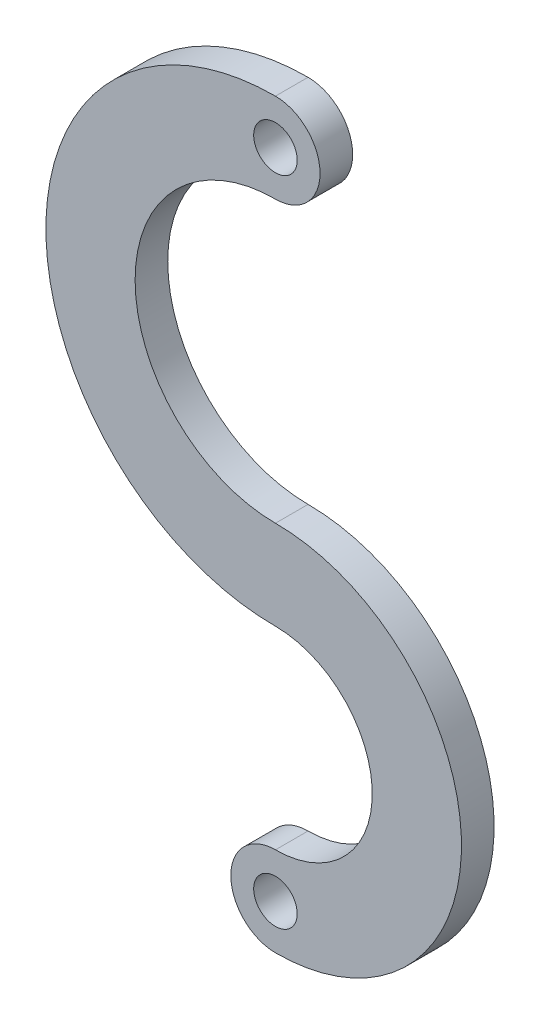
ISO-10303-21;
HEADER;
FILE_DESCRIPTION(('STEP AP214'),'2;1');
FILE_NAME('part.step','',(''),(''),'','','');
FILE_SCHEMA(('AUTOMOTIVE_DESIGN { 1 0 10303 214 1 1 1 1 }'));
ENDSEC;
DATA;
#1=APPLICATION_CONTEXT('core data for automotive mechanical design processes');
#2=APPLICATION_PROTOCOL_DEFINITION('international standard','automotive_design',2000,#1);
#3=PRODUCT_CONTEXT('',#1,'mechanical');
#4=PRODUCT('Part','Part','',(#3));
#5=PRODUCT_RELATED_PRODUCT_CATEGORY('part','',(#4));
#6=PRODUCT_DEFINITION_FORMATION('','',#4);
#7=PRODUCT_DEFINITION_CONTEXT('part definition',#1,'design');
#8=PRODUCT_DEFINITION('design','',#6,#7);
#9=PRODUCT_DEFINITION_SHAPE('','',#8);
#10=(LENGTH_UNIT() NAMED_UNIT(*) SI_UNIT(.MILLI.,.METRE.));
#11=(NAMED_UNIT(*) PLANE_ANGLE_UNIT() SI_UNIT($,.RADIAN.));
#12=(NAMED_UNIT(*) SI_UNIT($,.STERADIAN.) SOLID_ANGLE_UNIT());
#13=UNCERTAINTY_MEASURE_WITH_UNIT(LENGTH_MEASURE(1.E-05),#10,'distance_accuracy_value','');
#14=(GEOMETRIC_REPRESENTATION_CONTEXT(3) GLOBAL_UNCERTAINTY_ASSIGNED_CONTEXT((#13)) GLOBAL_UNIT_ASSIGNED_CONTEXT((#10,
#11,#12)) REPRESENTATION_CONTEXT('',''));
#15=CARTESIAN_POINT('',(0.,0.,0.));
#16=DIRECTION('',(0.,0.,1.));
#17=DIRECTION('',(1.,0.,0.));
#18=AXIS2_PLACEMENT_3D('',#15,#16,#17);
#19=CARTESIAN_POINT('',(0.,-2.84134729219745,1.5));
#20=DIRECTION('',(0.,0.,1.));
#21=DIRECTION('',(1.,0.,0.));
#22=AXIS2_PLACEMENT_3D('',#19,#20,#21);
#23=PLANE('',#22);
#24=CARTESIAN_POINT('',(0.,1.40865270780255,1.5));
#25=DIRECTION('',(0.,0.,1.));
#26=DIRECTION('',(1.,0.,0.));
#27=AXIS2_PLACEMENT_3D('',#24,#25,#26);
#28=CIRCLE('',#27,1.);
#29=CARTESIAN_POINT('',(1.,1.40865270780255,1.5));
#30=VERTEX_POINT('',#29);
#31=EDGE_CURVE('E121',#30,#30,#28,.T.);
#32=ORIENTED_EDGE('',*,*,#31,.F.);
#33=EDGE_LOOP('',(#32));
#34=FACE_BOUND('',#33,.T.);
#35=CARTESIAN_POINT('',(0.,1.40865270780255,1.5));
#36=DIRECTION('',(0.,0.,1.));
#37=DIRECTION('',(1.,0.,0.));
#38=AXIS2_PLACEMENT_3D('',#35,#36,#37);
#39=CIRCLE('',#38,2.05);
#40=CARTESIAN_POINT('',(0.,-0.641347292197447,1.5));
#41=VERTEX_POINT('',#40);
#42=CARTESIAN_POINT('',(0.,3.45865270780255,1.5));
#43=VERTEX_POINT('',#42);
#44=EDGE_CURVE('E128',#41,#43,#39,.T.);
#45=ORIENTED_EDGE('',*,*,#44,.T.);
#46=CARTESIAN_POINT('',(0.,-7.09134729219745,1.5));
#47=DIRECTION('',(0.,0.,1.));
#48=DIRECTION('',(1.,0.,0.));
#49=AXIS2_PLACEMENT_3D('',#46,#47,#48);
#50=CIRCLE('',#49,10.55);
#51=CARTESIAN_POINT('',(0.,-17.6413472921974,1.5));
#52=VERTEX_POINT('',#51);
#53=EDGE_CURVE('E86',#43,#52,#50,.T.);
#54=ORIENTED_EDGE('',*,*,#53,.T.);
#55=CARTESIAN_POINT('',(0.,-22.0913472921974,1.5));
#56=DIRECTION('',(0.,0.,-1.));
#57=DIRECTION('',(1.,0.,0.));
#58=AXIS2_PLACEMENT_3D('',#55,#56,#57);
#59=CIRCLE('',#58,4.45);
#60=CARTESIAN_POINT('',(0.,-26.5413472921974,1.5));
#61=VERTEX_POINT('',#60);
#62=EDGE_CURVE('E99',#52,#61,#59,.T.);
#63=ORIENTED_EDGE('',*,*,#62,.T.);
#64=CARTESIAN_POINT('',(0.,-28.5913472921974,1.5));
#65=DIRECTION('',(0.,0.,1.));
#66=DIRECTION('',(1.,0.,0.));
#67=AXIS2_PLACEMENT_3D('',#64,#65,#66);
#68=CIRCLE('',#67,2.05);
#69=CARTESIAN_POINT('',(0.,-30.6413472921974,1.5));
#70=VERTEX_POINT('',#69);
#71=EDGE_CURVE('E93',#61,#70,#68,.T.);
#72=ORIENTED_EDGE('',*,*,#71,.T.);
#73=CARTESIAN_POINT('',(0.,-22.0913472921974,1.5));
#74=DIRECTION('',(0.,0.,1.));
#75=DIRECTION('',(1.,0.,0.));
#76=AXIS2_PLACEMENT_3D('',#73,#74,#75);
#77=CIRCLE('',#76,8.55);
#78=CARTESIAN_POINT('',(0.,-13.5413472921974,1.5));
#79=VERTEX_POINT('',#78);
#80=EDGE_CURVE('E97',#70,#79,#77,.T.);
#81=ORIENTED_EDGE('',*,*,#80,.T.);
#82=CARTESIAN_POINT('',(0.,-7.09134729219745,1.5));
#83=DIRECTION('',(0.,0.,-1.));
#84=DIRECTION('',(1.,0.,0.));
#85=AXIS2_PLACEMENT_3D('',#82,#83,#84);
#86=CIRCLE('',#85,6.45);
#87=EDGE_CURVE('E49',#79,#41,#86,.T.);
#88=ORIENTED_EDGE('',*,*,#87,.T.);
#89=EDGE_LOOP('',(#45,#54,#63,#72,#81,#88));
#90=FACE_BOUND('',#89,.T.);
#91=CARTESIAN_POINT('',(0.,-28.5913472921974,1.5));
#92=DIRECTION('',(0.,0.,1.));
#93=DIRECTION('',(1.,0.,0.));
#94=AXIS2_PLACEMENT_3D('',#91,#92,#93);
#95=CIRCLE('',#94,1.);
#96=CARTESIAN_POINT('',(1.,-28.5913472921974,1.5));
#97=VERTEX_POINT('',#96);
#98=EDGE_CURVE('E170',#97,#97,#95,.T.);
#99=ORIENTED_EDGE('',*,*,#98,.F.);
#100=EDGE_LOOP('',(#99));
#101=FACE_BOUND('',#100,.T.);
#102=ADVANCED_FACE('F32',(#34,#90,#101),#23,.T.);
#103=CARTESIAN_POINT('',(0.,-2.84134729219745,0.));
#104=DIRECTION('',(0.,0.,1.));
#105=DIRECTION('',(1.,0.,0.));
#106=AXIS2_PLACEMENT_3D('',#103,#104,#105);
#107=PLANE('',#106);
#108=CARTESIAN_POINT('',(0.,1.40865270780255,0.));
#109=DIRECTION('',(0.,0.,1.));
#110=DIRECTION('',(1.,0.,0.));
#111=AXIS2_PLACEMENT_3D('',#108,#109,#110);
#112=CIRCLE('',#111,2.05);
#113=CARTESIAN_POINT('',(0.,-0.641347292197447,0.));
#114=VERTEX_POINT('',#113);
#115=CARTESIAN_POINT('',(0.,3.45865270780255,0.));
#116=VERTEX_POINT('',#115);
#117=EDGE_CURVE('E117',#114,#116,#112,.T.);
#118=ORIENTED_EDGE('',*,*,#117,.F.);
#119=CARTESIAN_POINT('',(0.,-7.09134729219745,0.));
#120=DIRECTION('',(0.,0.,-1.));
#121=DIRECTION('',(1.,0.,0.));
#122=AXIS2_PLACEMENT_3D('',#119,#120,#121);
#123=CIRCLE('',#122,6.45);
#124=CARTESIAN_POINT('',(0.,-13.5413472921974,0.));
#125=VERTEX_POINT('',#124);
#126=EDGE_CURVE('E78',#125,#114,#123,.T.);
#127=ORIENTED_EDGE('',*,*,#126,.F.);
#128=CARTESIAN_POINT('',(0.,-22.0913472921974,0.));
#129=DIRECTION('',(0.,0.,1.));
#130=DIRECTION('',(1.,0.,0.));
#131=AXIS2_PLACEMENT_3D('',#128,#129,#130);
#132=CIRCLE('',#131,8.55);
#133=CARTESIAN_POINT('',(0.,-30.6413472921974,0.));
#134=VERTEX_POINT('',#133);
#135=EDGE_CURVE('E72',#134,#125,#132,.T.);
#136=ORIENTED_EDGE('',*,*,#135,.F.);
#137=CARTESIAN_POINT('',(0.,-28.5913472921974,0.));
#138=DIRECTION('',(0.,0.,1.));
#139=DIRECTION('',(1.,0.,0.));
#140=AXIS2_PLACEMENT_3D('',#137,#138,#139);
#141=CIRCLE('',#140,2.05);
#142=CARTESIAN_POINT('',(0.,-26.5413472921974,0.));
#143=VERTEX_POINT('',#142);
#144=EDGE_CURVE('E107',#143,#134,#141,.T.);
#145=ORIENTED_EDGE('',*,*,#144,.F.);
#146=CARTESIAN_POINT('',(0.,-22.0913472921974,0.));
#147=DIRECTION('',(0.,0.,-1.));
#148=DIRECTION('',(1.,0.,0.));
#149=AXIS2_PLACEMENT_3D('',#146,#147,#148);
#150=CIRCLE('',#149,4.45);
#151=CARTESIAN_POINT('',(0.,-17.6413472921974,0.));
#152=VERTEX_POINT('',#151);
#153=EDGE_CURVE('E123',#152,#143,#150,.T.);
#154=ORIENTED_EDGE('',*,*,#153,.F.);
#155=CARTESIAN_POINT('',(0.,-7.09134729219745,0.));
#156=DIRECTION('',(0.,0.,1.));
#157=DIRECTION('',(1.,0.,0.));
#158=AXIS2_PLACEMENT_3D('',#155,#156,#157);
#159=CIRCLE('',#158,10.55);
#160=EDGE_CURVE('E120',#116,#152,#159,.T.);
#161=ORIENTED_EDGE('',*,*,#160,.F.);
#162=EDGE_LOOP('',(#118,#127,#136,#145,#154,#161));
#163=FACE_BOUND('',#162,.T.);
#164=CARTESIAN_POINT('',(0.,1.40865270780255,0.));
#165=DIRECTION('',(0.,0.,1.));
#166=DIRECTION('',(1.,0.,0.));
#167=AXIS2_PLACEMENT_3D('',#164,#165,#166);
#168=CIRCLE('',#167,1.);
#169=CARTESIAN_POINT('',(1.,1.40865270780255,0.));
#170=VERTEX_POINT('',#169);
#171=EDGE_CURVE('E176',#170,#170,#168,.T.);
#172=ORIENTED_EDGE('',*,*,#171,.T.);
#173=EDGE_LOOP('',(#172));
#174=FACE_BOUND('',#173,.T.);
#175=CARTESIAN_POINT('',(0.,-28.5913472921974,0.));
#176=DIRECTION('',(0.,0.,1.));
#177=DIRECTION('',(1.,0.,0.));
#178=AXIS2_PLACEMENT_3D('',#175,#176,#177);
#179=CIRCLE('',#178,1.);
#180=CARTESIAN_POINT('',(1.,-28.5913472921974,0.));
#181=VERTEX_POINT('',#180);
#182=EDGE_CURVE('E173',#181,#181,#179,.T.);
#183=ORIENTED_EDGE('',*,*,#182,.T.);
#184=EDGE_LOOP('',(#183));
#185=FACE_BOUND('',#184,.T.);
#186=ADVANCED_FACE('F137',(#163,#174,#185),#107,.F.);
#187=CARTESIAN_POINT('',(0.,1.40865270780255,1.5));
#188=DIRECTION('',(0.,0.,-1.));
#189=DIRECTION('',(-1.,0.,0.));
#190=AXIS2_PLACEMENT_3D('',#187,#188,#189);
#191=CYLINDRICAL_SURFACE('',#190,2.05);
#192=ORIENTED_EDGE('',*,*,#117,.T.);
#193=DIRECTION('',(0.,0.,-1.));
#194=VECTOR('',#193,1.);
#195=CARTESIAN_POINT('',(0.,3.45865270780255,1.5));
#196=LINE('',#195,#194);
#197=EDGE_CURVE('E11',#43,#116,#196,.T.);
#198=ORIENTED_EDGE('',*,*,#197,.F.);
#199=ORIENTED_EDGE('',*,*,#44,.F.);
#200=DIRECTION('',(0.,0.,-1.));
#201=VECTOR('',#200,1.);
#202=CARTESIAN_POINT('',(0.,-0.641347292197447,1.5));
#203=LINE('',#202,#201);
#204=EDGE_CURVE('E113',#41,#114,#203,.T.);
#205=ORIENTED_EDGE('',*,*,#204,.T.);
#206=EDGE_LOOP('',(#192,#198,#199,#205));
#207=FACE_BOUND('',#206,.T.);
#208=ADVANCED_FACE('F34',(#207),#191,.T.);
#209=CARTESIAN_POINT('',(0.,-7.09134729219745,1.5));
#210=DIRECTION('',(0.,0.,-1.));
#211=DIRECTION('',(-1.,0.,0.));
#212=AXIS2_PLACEMENT_3D('',#209,#210,#211);
#213=CYLINDRICAL_SURFACE('',#212,10.55);
#214=ORIENTED_EDGE('',*,*,#160,.T.);
#215=DIRECTION('',(0.,0.,-1.));
#216=VECTOR('',#215,1.);
#217=CARTESIAN_POINT('',(0.,-17.6413472921974,1.5));
#218=LINE('',#217,#216);
#219=EDGE_CURVE('E41',#52,#152,#218,.T.);
#220=ORIENTED_EDGE('',*,*,#219,.F.);
#221=ORIENTED_EDGE('',*,*,#53,.F.);
#222=ORIENTED_EDGE('',*,*,#197,.T.);
#223=EDGE_LOOP('',(#214,#220,#221,#222));
#224=FACE_BOUND('',#223,.T.);
#225=ADVANCED_FACE('F217',(#224),#213,.T.);
#226=CARTESIAN_POINT('',(0.,-22.0913472921974,1.5));
#227=DIRECTION('',(0.,0.,-1.));
#228=DIRECTION('',(-1.,0.,0.));
#229=AXIS2_PLACEMENT_3D('',#226,#227,#228);
#230=CYLINDRICAL_SURFACE('',#229,4.45);
#231=ORIENTED_EDGE('',*,*,#153,.T.);
#232=DIRECTION('',(0.,0.,-1.));
#233=VECTOR('',#232,1.);
#234=CARTESIAN_POINT('',(0.,-26.5413472921974,1.5));
#235=LINE('',#234,#233);
#236=EDGE_CURVE('E108',#61,#143,#235,.T.);
#237=ORIENTED_EDGE('',*,*,#236,.F.);
#238=ORIENTED_EDGE('',*,*,#62,.F.);
#239=ORIENTED_EDGE('',*,*,#219,.T.);
#240=EDGE_LOOP('',(#231,#237,#238,#239));
#241=FACE_BOUND('',#240,.T.);
#242=ADVANCED_FACE('F134',(#241),#230,.F.);
#243=CARTESIAN_POINT('',(0.,-28.5913472921974,1.5));
#244=DIRECTION('',(0.,0.,-1.));
#245=DIRECTION('',(-1.,0.,0.));
#246=AXIS2_PLACEMENT_3D('',#243,#244,#245);
#247=CYLINDRICAL_SURFACE('',#246,2.05);
#248=ORIENTED_EDGE('',*,*,#144,.T.);
#249=DIRECTION('',(0.,0.,-1.));
#250=VECTOR('',#249,1.);
#251=CARTESIAN_POINT('',(0.,-30.6413472921974,1.5));
#252=LINE('',#251,#250);
#253=EDGE_CURVE('E104',#70,#134,#252,.T.);
#254=ORIENTED_EDGE('',*,*,#253,.F.);
#255=ORIENTED_EDGE('',*,*,#71,.F.);
#256=ORIENTED_EDGE('',*,*,#236,.T.);
#257=EDGE_LOOP('',(#248,#254,#255,#256));
#258=FACE_BOUND('',#257,.T.);
#259=ADVANCED_FACE('F105',(#258),#247,.T.);
#260=CARTESIAN_POINT('',(0.,-22.0913472921974,1.5));
#261=DIRECTION('',(0.,0.,-1.));
#262=DIRECTION('',(-1.,0.,0.));
#263=AXIS2_PLACEMENT_3D('',#260,#261,#262);
#264=CYLINDRICAL_SURFACE('',#263,8.55);
#265=ORIENTED_EDGE('',*,*,#135,.T.);
#266=DIRECTION('',(0.,0.,-1.));
#267=VECTOR('',#266,1.);
#268=CARTESIAN_POINT('',(0.,-13.5413472921974,1.5));
#269=LINE('',#268,#267);
#270=EDGE_CURVE('E109',#79,#125,#269,.T.);
#271=ORIENTED_EDGE('',*,*,#270,.F.);
#272=ORIENTED_EDGE('',*,*,#80,.F.);
#273=ORIENTED_EDGE('',*,*,#253,.T.);
#274=EDGE_LOOP('',(#265,#271,#272,#273));
#275=FACE_BOUND('',#274,.T.);
#276=ADVANCED_FACE('F111',(#275),#264,.T.);
#277=CARTESIAN_POINT('',(0.,-7.09134729219745,1.5));
#278=DIRECTION('',(0.,0.,-1.));
#279=DIRECTION('',(-1.,0.,0.));
#280=AXIS2_PLACEMENT_3D('',#277,#278,#279);
#281=CYLINDRICAL_SURFACE('',#280,6.45);
#282=ORIENTED_EDGE('',*,*,#126,.T.);
#283=ORIENTED_EDGE('',*,*,#204,.F.);
#284=ORIENTED_EDGE('',*,*,#87,.F.);
#285=ORIENTED_EDGE('',*,*,#270,.T.);
#286=EDGE_LOOP('',(#282,#283,#284,#285));
#287=FACE_BOUND('',#286,.T.);
#288=ADVANCED_FACE('F142',(#287),#281,.F.);
#289=CARTESIAN_POINT('',(0.,1.40865270780255,1.5));
#290=DIRECTION('',(0.,0.,-1.));
#291=DIRECTION('',(-1.,0.,0.));
#292=AXIS2_PLACEMENT_3D('',#289,#290,#291);
#293=CYLINDRICAL_SURFACE('',#292,1.);
#294=ORIENTED_EDGE('',*,*,#31,.T.);
#295=EDGE_LOOP('',(#294));
#296=FACE_BOUND('',#295,.T.);
#297=ORIENTED_EDGE('',*,*,#171,.F.);
#298=EDGE_LOOP('',(#297));
#299=FACE_BOUND('',#298,.T.);
#300=ADVANCED_FACE('F144',(#296,#299),#293,.F.);
#301=CARTESIAN_POINT('',(0.,-28.5913472921974,1.5));
#302=DIRECTION('',(0.,0.,-1.));
#303=DIRECTION('',(-1.,0.,0.));
#304=AXIS2_PLACEMENT_3D('',#301,#302,#303);
#305=CYLINDRICAL_SURFACE('',#304,1.);
#306=ORIENTED_EDGE('',*,*,#98,.T.);
#307=EDGE_LOOP('',(#306));
#308=FACE_BOUND('',#307,.T.);
#309=ORIENTED_EDGE('',*,*,#182,.F.);
#310=EDGE_LOOP('',(#309));
#311=FACE_BOUND('',#310,.T.);
#312=ADVANCED_FACE('F150',(#308,#311),#305,.F.);
#313=CLOSED_SHELL('',(#102,#186,#208,#225,#242,#259,#276,#288,#300,#312));
#314=MANIFOLD_SOLID_BREP('B2',#313);
#315=ADVANCED_BREP_SHAPE_REPRESENTATION('',(#18,#314),#14);
#316=SHAPE_DEFINITION_REPRESENTATION(#9,#315);
ENDSEC;
END-ISO-10303-21;
